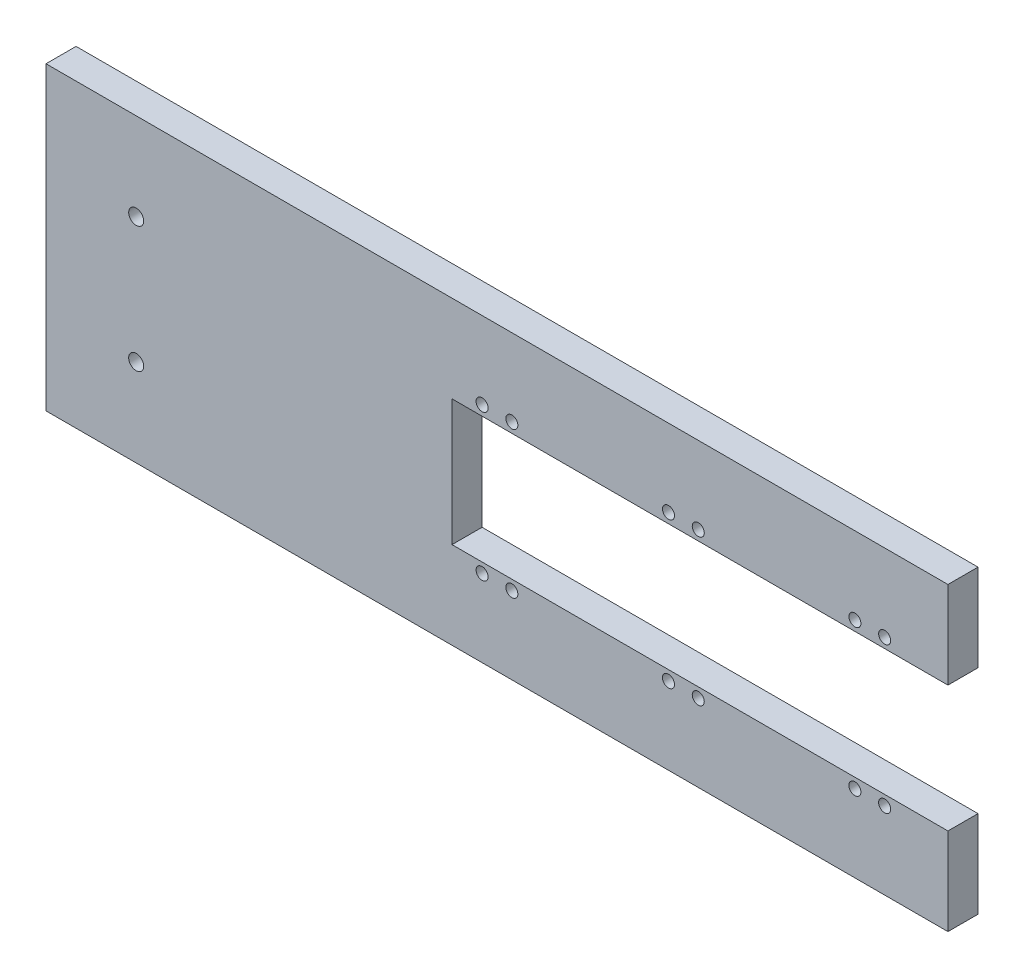
ISO-10303-21;
HEADER;
FILE_DESCRIPTION(('STEP AP214'),'2;1');
FILE_NAME('part.step','',(''),(''),'','','');
FILE_SCHEMA(('AUTOMOTIVE_DESIGN { 1 0 10303 214 1 1 1 1 }'));
ENDSEC;
DATA;
#1=APPLICATION_CONTEXT('core data for automotive mechanical design processes');
#2=APPLICATION_PROTOCOL_DEFINITION('international standard','automotive_design',2000,#1);
#3=PRODUCT_CONTEXT('',#1,'mechanical');
#4=PRODUCT('Part','Part','',(#3));
#5=PRODUCT_RELATED_PRODUCT_CATEGORY('part','',(#4));
#6=PRODUCT_DEFINITION_FORMATION('','',#4);
#7=PRODUCT_DEFINITION_CONTEXT('part definition',#1,'design');
#8=PRODUCT_DEFINITION('design','',#6,#7);
#9=PRODUCT_DEFINITION_SHAPE('','',#8);
#10=(LENGTH_UNIT() NAMED_UNIT(*) SI_UNIT(.MILLI.,.METRE.));
#11=(NAMED_UNIT(*) PLANE_ANGLE_UNIT() SI_UNIT($,.RADIAN.));
#12=(NAMED_UNIT(*) SI_UNIT($,.STERADIAN.) SOLID_ANGLE_UNIT());
#13=UNCERTAINTY_MEASURE_WITH_UNIT(LENGTH_MEASURE(1.E-05),#10,'distance_accuracy_value','');
#14=(GEOMETRIC_REPRESENTATION_CONTEXT(3) GLOBAL_UNCERTAINTY_ASSIGNED_CONTEXT((#13)) GLOBAL_UNIT_ASSIGNED_CONTEXT((#10,
#11,#12)) REPRESENTATION_CONTEXT('',''));
#15=CARTESIAN_POINT('',(0.,0.,0.));
#16=DIRECTION('',(0.,0.,1.));
#17=DIRECTION('',(1.,0.,0.));
#18=AXIS2_PLACEMENT_3D('',#15,#16,#17);
#19=CARTESIAN_POINT('',(150.,50.,-10.));
#20=DIRECTION('',(1.,0.,0.));
#21=DIRECTION('',(0.,0.,-1.));
#22=AXIS2_PLACEMENT_3D('',#19,#20,#21);
#23=PLANE('',#22);
#24=DIRECTION('',(0.,0.,1.));
#25=VECTOR('',#24,1.);
#26=CARTESIAN_POINT('',(150.,21.,-10.));
#27=LINE('',#26,#25);
#28=CARTESIAN_POINT('',(150.,21.,-10.));
#29=VERTEX_POINT('',#28);
#30=CARTESIAN_POINT('',(150.,21.,0.));
#31=VERTEX_POINT('',#30);
#32=EDGE_CURVE('E145',#29,#31,#27,.T.);
#33=ORIENTED_EDGE('',*,*,#32,.F.);
#34=DIRECTION('',(0.,1.,0.));
#35=VECTOR('',#34,1.);
#36=CARTESIAN_POINT('',(150.,50.,-10.));
#37=LINE('',#36,#35);
#38=CARTESIAN_POINT('',(150.,50.,-10.));
#39=VERTEX_POINT('',#38);
#40=EDGE_CURVE('E225',#29,#39,#37,.T.);
#41=ORIENTED_EDGE('',*,*,#40,.T.);
#42=DIRECTION('',(0.,0.,1.));
#43=VECTOR('',#42,1.);
#44=CARTESIAN_POINT('',(150.,50.,-10.));
#45=LINE('',#44,#43);
#46=CARTESIAN_POINT('',(150.,50.,0.));
#47=VERTEX_POINT('',#46);
#48=EDGE_CURVE('E46',#39,#47,#45,.T.);
#49=ORIENTED_EDGE('',*,*,#48,.T.);
#50=DIRECTION('',(0.,1.,0.));
#51=VECTOR('',#50,1.);
#52=CARTESIAN_POINT('',(150.,50.,0.));
#53=LINE('',#52,#51);
#54=EDGE_CURVE('E235',#31,#47,#53,.T.);
#55=ORIENTED_EDGE('',*,*,#54,.F.);
#56=EDGE_LOOP('',(#33,#41,#49,#55));
#57=FACE_BOUND('',#56,.T.);
#58=ADVANCED_FACE('F37',(#57),#23,.T.);
#59=CARTESIAN_POINT('',(-150.,50.,-10.));
#60=DIRECTION('',(-1.,0.,0.));
#61=DIRECTION('',(0.,0.,1.));
#62=AXIS2_PLACEMENT_3D('',#59,#60,#61);
#63=PLANE('',#62);
#64=DIRECTION('',(0.,-1.,0.));
#65=VECTOR('',#64,1.);
#66=CARTESIAN_POINT('',(-150.,50.,0.));
#67=LINE('',#66,#65);
#68=CARTESIAN_POINT('',(-150.,50.,0.));
#69=VERTEX_POINT('',#68);
#70=CARTESIAN_POINT('',(-150.,-50.,0.));
#71=VERTEX_POINT('',#70);
#72=EDGE_CURVE('E217',#69,#71,#67,.T.);
#73=ORIENTED_EDGE('',*,*,#72,.F.);
#74=DIRECTION('',(0.,0.,1.));
#75=VECTOR('',#74,1.);
#76=CARTESIAN_POINT('',(-150.,50.,-10.));
#77=LINE('',#76,#75);
#78=CARTESIAN_POINT('',(-150.,50.,-10.));
#79=VERTEX_POINT('',#78);
#80=EDGE_CURVE('E11',#79,#69,#77,.T.);
#81=ORIENTED_EDGE('',*,*,#80,.F.);
#82=DIRECTION('',(0.,-1.,0.));
#83=VECTOR('',#82,1.);
#84=CARTESIAN_POINT('',(-150.,50.,-10.));
#85=LINE('',#84,#83);
#86=CARTESIAN_POINT('',(-150.,-50.,-10.));
#87=VERTEX_POINT('',#86);
#88=EDGE_CURVE('E220',#79,#87,#85,.T.);
#89=ORIENTED_EDGE('',*,*,#88,.T.);
#90=DIRECTION('',(0.,0.,1.));
#91=VECTOR('',#90,1.);
#92=CARTESIAN_POINT('',(-150.,-50.,-10.));
#93=LINE('',#92,#91);
#94=EDGE_CURVE('E41',#87,#71,#93,.T.);
#95=ORIENTED_EDGE('',*,*,#94,.T.);
#96=EDGE_LOOP('',(#73,#81,#89,#95));
#97=FACE_BOUND('',#96,.T.);
#98=ADVANCED_FACE('F39',(#97),#63,.T.);
#99=CARTESIAN_POINT('',(-150.,50.,-10.));
#100=DIRECTION('',(0.,1.,0.));
#101=DIRECTION('',(0.,0.,1.));
#102=AXIS2_PLACEMENT_3D('',#99,#100,#101);
#103=PLANE('',#102);
#104=DIRECTION('',(-1.,0.,0.));
#105=VECTOR('',#104,1.);
#106=CARTESIAN_POINT('',(-150.,50.,0.));
#107=LINE('',#106,#105);
#108=EDGE_CURVE('E223',#47,#69,#107,.T.);
#109=ORIENTED_EDGE('',*,*,#108,.F.);
#110=ORIENTED_EDGE('',*,*,#48,.F.);
#111=DIRECTION('',(-1.,0.,0.));
#112=VECTOR('',#111,1.);
#113=CARTESIAN_POINT('',(-150.,50.,-10.));
#114=LINE('',#113,#112);
#115=EDGE_CURVE('E228',#39,#79,#114,.T.);
#116=ORIENTED_EDGE('',*,*,#115,.T.);
#117=ORIENTED_EDGE('',*,*,#80,.T.);
#118=EDGE_LOOP('',(#109,#110,#116,#117));
#119=FACE_BOUND('',#118,.T.);
#120=ADVANCED_FACE('F251',(#119),#103,.T.);
#121=DIRECTION('',(0.,0.,1.));
#122=VECTOR('',#121,1.);
#123=CARTESIAN_POINT('',(150.,-21.,-10.));
#124=LINE('',#123,#122);
#125=CARTESIAN_POINT('',(150.,-21.,-10.));
#126=VERTEX_POINT('',#125);
#127=CARTESIAN_POINT('',(150.,-21.,0.));
#128=VERTEX_POINT('',#127);
#129=EDGE_CURVE('E116',#126,#128,#124,.T.);
#130=ORIENTED_EDGE('',*,*,#129,.T.);
#131=CARTESIAN_POINT('',(150.,-50.,0.));
#132=VERTEX_POINT('',#131);
#133=EDGE_CURVE('E236',#132,#128,#53,.T.);
#134=ORIENTED_EDGE('',*,*,#133,.F.);
#135=DIRECTION('',(0.,0.,1.));
#136=VECTOR('',#135,1.);
#137=CARTESIAN_POINT('',(150.,-50.,-10.));
#138=LINE('',#137,#136);
#139=CARTESIAN_POINT('',(150.,-50.,-10.));
#140=VERTEX_POINT('',#139);
#141=EDGE_CURVE('E242',#140,#132,#138,.T.);
#142=ORIENTED_EDGE('',*,*,#141,.F.);
#143=EDGE_CURVE('E226',#140,#126,#37,.T.);
#144=ORIENTED_EDGE('',*,*,#143,.T.);
#145=EDGE_LOOP('',(#130,#134,#142,#144));
#146=FACE_BOUND('',#145,.T.);
#147=ADVANCED_FACE('F255',(#146),#23,.T.);
#148=CARTESIAN_POINT('',(-150.,-50.,-10.));
#149=DIRECTION('',(0.,-1.,0.));
#150=DIRECTION('',(0.,0.,-1.));
#151=AXIS2_PLACEMENT_3D('',#148,#149,#150);
#152=PLANE('',#151);
#153=DIRECTION('',(1.,0.,0.));
#154=VECTOR('',#153,1.);
#155=CARTESIAN_POINT('',(-150.,-50.,0.));
#156=LINE('',#155,#154);
#157=EDGE_CURVE('E232',#71,#132,#156,.T.);
#158=ORIENTED_EDGE('',*,*,#157,.F.);
#159=ORIENTED_EDGE('',*,*,#94,.F.);
#160=DIRECTION('',(1.,0.,0.));
#161=VECTOR('',#160,1.);
#162=CARTESIAN_POINT('',(-150.,-50.,-10.));
#163=LINE('',#162,#161);
#164=EDGE_CURVE('E222',#87,#140,#163,.T.);
#165=ORIENTED_EDGE('',*,*,#164,.T.);
#166=ORIENTED_EDGE('',*,*,#141,.T.);
#167=EDGE_LOOP('',(#158,#159,#165,#166));
#168=FACE_BOUND('',#167,.T.);
#169=ADVANCED_FACE('F244',(#168),#152,.T.);
#170=CARTESIAN_POINT('',(0.,0.,-10.));
#171=DIRECTION('',(0.,0.,1.));
#172=DIRECTION('',(1.,0.,0.));
#173=AXIS2_PLACEMENT_3D('',#170,#171,#172);
#174=PLANE('',#173);
#175=CARTESIAN_POINT('',(-120.,20.9311361599589,-10.));
#176=DIRECTION('',(0.,0.,1.));
#177=DIRECTION('',(1.,0.,0.));
#178=AXIS2_PLACEMENT_3D('',#175,#176,#177);
#179=CIRCLE('',#178,2.50000000000001);
#180=CARTESIAN_POINT('',(-117.5,20.9311361599589,-10.));
#181=VERTEX_POINT('',#180);
#182=EDGE_CURVE('E140',#181,#181,#179,.T.);
#183=ORIENTED_EDGE('',*,*,#182,.T.);
#184=EDGE_LOOP('',(#183));
#185=FACE_BOUND('',#184,.T.);
#186=CARTESIAN_POINT('',(-120.,-20.9311361599589,-10.));
#187=DIRECTION('',(0.,0.,1.));
#188=DIRECTION('',(-1.,0.,0.));
#189=AXIS2_PLACEMENT_3D('',#186,#187,#188);
#190=CIRCLE('',#189,2.50000000000001);
#191=CARTESIAN_POINT('',(-122.5,-20.9311361599589,-10.));
#192=VERTEX_POINT('',#191);
#193=EDGE_CURVE('E455',#192,#192,#190,.T.);
#194=ORIENTED_EDGE('',*,*,#193,.T.);
#195=EDGE_LOOP('',(#194));
#196=FACE_BOUND('',#195,.T.);
#197=CARTESIAN_POINT('',(128.95,24.3,-10.));
#198=DIRECTION('',(0.,0.,1.));
#199=DIRECTION('',(-1.,0.,0.));
#200=AXIS2_PLACEMENT_3D('',#197,#198,#199);
#201=CIRCLE('',#200,2.);
#202=CARTESIAN_POINT('',(126.95,24.3,-10.));
#203=VERTEX_POINT('',#202);
#204=EDGE_CURVE('E161',#203,#203,#201,.T.);
#205=ORIENTED_EDGE('',*,*,#204,.T.);
#206=EDGE_LOOP('',(#205));
#207=FACE_BOUND('',#206,.T.);
#208=CARTESIAN_POINT('',(119.05,24.3,-10.));
#209=DIRECTION('',(0.,0.,1.));
#210=DIRECTION('',(1.,0.,0.));
#211=AXIS2_PLACEMENT_3D('',#208,#209,#210);
#212=CIRCLE('',#211,2.);
#213=CARTESIAN_POINT('',(121.05,24.3,-10.));
#214=VERTEX_POINT('',#213);
#215=EDGE_CURVE('E155',#214,#214,#212,.T.);
#216=ORIENTED_EDGE('',*,*,#215,.T.);
#217=EDGE_LOOP('',(#216));
#218=FACE_BOUND('',#217,.T.);
#219=CARTESIAN_POINT('',(119.05,-24.3,-10.));
#220=DIRECTION('',(0.,0.,1.));
#221=DIRECTION('',(-1.,0.,0.));
#222=AXIS2_PLACEMENT_3D('',#219,#220,#221);
#223=CIRCLE('',#222,2.);
#224=CARTESIAN_POINT('',(117.05,-24.3,-10.));
#225=VERTEX_POINT('',#224);
#226=EDGE_CURVE('E148',#225,#225,#223,.T.);
#227=ORIENTED_EDGE('',*,*,#226,.T.);
#228=EDGE_LOOP('',(#227));
#229=FACE_BOUND('',#228,.T.);
#230=CARTESIAN_POINT('',(128.95,-24.3,-10.));
#231=DIRECTION('',(0.,0.,1.));
#232=DIRECTION('',(1.,0.,0.));
#233=AXIS2_PLACEMENT_3D('',#230,#231,#232);
#234=CIRCLE('',#233,2.);
#235=CARTESIAN_POINT('',(130.95,-24.3,-10.));
#236=VERTEX_POINT('',#235);
#237=EDGE_CURVE('E185',#236,#236,#234,.T.);
#238=ORIENTED_EDGE('',*,*,#237,.T.);
#239=EDGE_LOOP('',(#238));
#240=FACE_BOUND('',#239,.T.);
#241=CARTESIAN_POINT('',(66.95,24.3,-10.));
#242=DIRECTION('',(0.,0.,1.));
#243=DIRECTION('',(-1.,0.,0.));
#244=AXIS2_PLACEMENT_3D('',#241,#242,#243);
#245=CIRCLE('',#244,2.);
#246=CARTESIAN_POINT('',(64.95,24.3,-10.));
#247=VERTEX_POINT('',#246);
#248=EDGE_CURVE('E179',#247,#247,#245,.T.);
#249=ORIENTED_EDGE('',*,*,#248,.T.);
#250=EDGE_LOOP('',(#249));
#251=FACE_BOUND('',#250,.T.);
#252=CARTESIAN_POINT('',(57.05,24.3,-10.));
#253=DIRECTION('',(0.,0.,1.));
#254=DIRECTION('',(1.,0.,0.));
#255=AXIS2_PLACEMENT_3D('',#252,#253,#254);
#256=CIRCLE('',#255,2.);
#257=CARTESIAN_POINT('',(59.05,24.3,-10.));
#258=VERTEX_POINT('',#257);
#259=EDGE_CURVE('E173',#258,#258,#256,.T.);
#260=ORIENTED_EDGE('',*,*,#259,.T.);
#261=EDGE_LOOP('',(#260));
#262=FACE_BOUND('',#261,.T.);
#263=CARTESIAN_POINT('',(57.05,-24.3,-10.));
#264=DIRECTION('',(0.,0.,1.));
#265=DIRECTION('',(-1.,0.,0.));
#266=AXIS2_PLACEMENT_3D('',#263,#264,#265);
#267=CIRCLE('',#266,2.);
#268=CARTESIAN_POINT('',(55.05,-24.3,-10.));
#269=VERTEX_POINT('',#268);
#270=EDGE_CURVE('E166',#269,#269,#267,.T.);
#271=ORIENTED_EDGE('',*,*,#270,.T.);
#272=EDGE_LOOP('',(#271));
#273=FACE_BOUND('',#272,.T.);
#274=CARTESIAN_POINT('',(66.95,-24.3,-10.));
#275=DIRECTION('',(0.,0.,1.));
#276=DIRECTION('',(1.,0.,0.));
#277=AXIS2_PLACEMENT_3D('',#274,#275,#276);
#278=CIRCLE('',#277,2.);
#279=CARTESIAN_POINT('',(68.95,-24.3,-10.));
#280=VERTEX_POINT('',#279);
#281=EDGE_CURVE('E190',#280,#280,#278,.T.);
#282=ORIENTED_EDGE('',*,*,#281,.T.);
#283=EDGE_LOOP('',(#282));
#284=FACE_BOUND('',#283,.T.);
#285=CARTESIAN_POINT('',(4.95,24.3,-10.));
#286=DIRECTION('',(0.,0.,1.));
#287=DIRECTION('',(-1.,0.,0.));
#288=AXIS2_PLACEMENT_3D('',#285,#286,#287);
#289=CIRCLE('',#288,2.);
#290=CARTESIAN_POINT('',(2.95,24.3,-10.));
#291=VERTEX_POINT('',#290);
#292=EDGE_CURVE('E209',#291,#291,#289,.T.);
#293=ORIENTED_EDGE('',*,*,#292,.T.);
#294=EDGE_LOOP('',(#293));
#295=FACE_BOUND('',#294,.T.);
#296=CARTESIAN_POINT('',(-4.95,24.3,-10.));
#297=DIRECTION('',(0.,0.,1.));
#298=DIRECTION('',(1.,0.,0.));
#299=AXIS2_PLACEMENT_3D('',#296,#297,#298);
#300=CIRCLE('',#299,2.);
#301=CARTESIAN_POINT('',(-2.95,24.3,-10.));
#302=VERTEX_POINT('',#301);
#303=EDGE_CURVE('E203',#302,#302,#300,.T.);
#304=ORIENTED_EDGE('',*,*,#303,.T.);
#305=EDGE_LOOP('',(#304));
#306=FACE_BOUND('',#305,.T.);
#307=CARTESIAN_POINT('',(-4.95,-24.3,-10.));
#308=DIRECTION('',(0.,0.,1.));
#309=DIRECTION('',(-1.,0.,0.));
#310=AXIS2_PLACEMENT_3D('',#307,#308,#309);
#311=CIRCLE('',#310,2.);
#312=CARTESIAN_POINT('',(-6.95,-24.3,-10.));
#313=VERTEX_POINT('',#312);
#314=EDGE_CURVE('E196',#313,#313,#311,.T.);
#315=ORIENTED_EDGE('',*,*,#314,.T.);
#316=EDGE_LOOP('',(#315));
#317=FACE_BOUND('',#316,.T.);
#318=CARTESIAN_POINT('',(4.95,-24.3,-10.));
#319=DIRECTION('',(0.,0.,1.));
#320=DIRECTION('',(1.,0.,0.));
#321=AXIS2_PLACEMENT_3D('',#318,#319,#320);
#322=CIRCLE('',#321,2.);
#323=CARTESIAN_POINT('',(6.95,-24.3,-10.));
#324=VERTEX_POINT('',#323);
#325=EDGE_CURVE('E214',#324,#324,#322,.T.);
#326=ORIENTED_EDGE('',*,*,#325,.T.);
#327=EDGE_LOOP('',(#326));
#328=FACE_BOUND('',#327,.T.);
#329=ORIENTED_EDGE('',*,*,#40,.F.);
#330=DIRECTION('',(-1.,0.,0.));
#331=VECTOR('',#330,1.);
#332=CARTESIAN_POINT('',(-14.95,21.,-10.));
#333=LINE('',#332,#331);
#334=CARTESIAN_POINT('',(-14.95,21.,-10.));
#335=VERTEX_POINT('',#334);
#336=EDGE_CURVE('E117',#29,#335,#333,.T.);
#337=ORIENTED_EDGE('',*,*,#336,.T.);
#338=DIRECTION('',(0.,-1.,0.));
#339=VECTOR('',#338,1.);
#340=CARTESIAN_POINT('',(-14.95,21.,-10.));
#341=LINE('',#340,#339);
#342=CARTESIAN_POINT('',(-14.95,-21.,-10.));
#343=VERTEX_POINT('',#342);
#344=EDGE_CURVE('E112',#335,#343,#341,.T.);
#345=ORIENTED_EDGE('',*,*,#344,.T.);
#346=DIRECTION('',(1.,0.,0.));
#347=VECTOR('',#346,1.);
#348=CARTESIAN_POINT('',(-14.95,-21.,-10.));
#349=LINE('',#348,#347);
#350=EDGE_CURVE('E120',#343,#126,#349,.T.);
#351=ORIENTED_EDGE('',*,*,#350,.T.);
#352=ORIENTED_EDGE('',*,*,#143,.F.);
#353=ORIENTED_EDGE('',*,*,#164,.F.);
#354=ORIENTED_EDGE('',*,*,#88,.F.);
#355=ORIENTED_EDGE('',*,*,#115,.F.);
#356=EDGE_LOOP('',(#329,#337,#345,#351,#352,#353,#354,#355));
#357=FACE_BOUND('',#356,.T.);
#358=ADVANCED_FACE('F128',(#185,#196,#207,#218,#229,#240,#251,#262,#273,#284,#295,#306,#317,
#328,#357),#174,.F.);
#359=CARTESIAN_POINT('',(0.,0.,0.));
#360=DIRECTION('',(0.,0.,1.));
#361=DIRECTION('',(1.,0.,0.));
#362=AXIS2_PLACEMENT_3D('',#359,#360,#361);
#363=PLANE('',#362);
#364=CARTESIAN_POINT('',(-120.,20.9311361599589,0.));
#365=DIRECTION('',(0.,0.,1.));
#366=DIRECTION('',(1.,0.,0.));
#367=AXIS2_PLACEMENT_3D('',#364,#365,#366);
#368=CIRCLE('',#367,2.50000000000001);
#369=CARTESIAN_POINT('',(-117.5,20.9311361599589,0.));
#370=VERTEX_POINT('',#369);
#371=EDGE_CURVE('E454',#370,#370,#368,.T.);
#372=ORIENTED_EDGE('',*,*,#371,.F.);
#373=EDGE_LOOP('',(#372));
#374=FACE_BOUND('',#373,.T.);
#375=CARTESIAN_POINT('',(-120.,-20.9311361599589,0.));
#376=DIRECTION('',(0.,0.,1.));
#377=DIRECTION('',(-1.,0.,0.));
#378=AXIS2_PLACEMENT_3D('',#375,#376,#377);
#379=CIRCLE('',#378,2.50000000000001);
#380=CARTESIAN_POINT('',(-122.5,-20.9311361599589,0.));
#381=VERTEX_POINT('',#380);
#382=EDGE_CURVE('E135',#381,#381,#379,.T.);
#383=ORIENTED_EDGE('',*,*,#382,.F.);
#384=EDGE_LOOP('',(#383));
#385=FACE_BOUND('',#384,.T.);
#386=DIRECTION('',(-1.,0.,0.));
#387=VECTOR('',#386,1.);
#388=CARTESIAN_POINT('',(-14.95,21.,0.));
#389=LINE('',#388,#387);
#390=CARTESIAN_POINT('',(-14.95,21.,0.));
#391=VERTEX_POINT('',#390);
#392=EDGE_CURVE('E129',#31,#391,#389,.T.);
#393=ORIENTED_EDGE('',*,*,#392,.F.);
#394=ORIENTED_EDGE('',*,*,#54,.T.);
#395=ORIENTED_EDGE('',*,*,#108,.T.);
#396=ORIENTED_EDGE('',*,*,#72,.T.);
#397=ORIENTED_EDGE('',*,*,#157,.T.);
#398=ORIENTED_EDGE('',*,*,#133,.T.);
#399=DIRECTION('',(1.,0.,0.));
#400=VECTOR('',#399,1.);
#401=CARTESIAN_POINT('',(-14.95,-21.,0.));
#402=LINE('',#401,#400);
#403=CARTESIAN_POINT('',(-14.95,-21.,0.));
#404=VERTEX_POINT('',#403);
#405=EDGE_CURVE('E132',#404,#128,#402,.T.);
#406=ORIENTED_EDGE('',*,*,#405,.F.);
#407=DIRECTION('',(0.,-1.,0.));
#408=VECTOR('',#407,1.);
#409=CARTESIAN_POINT('',(-14.95,21.,0.));
#410=LINE('',#409,#408);
#411=EDGE_CURVE('E54',#391,#404,#410,.T.);
#412=ORIENTED_EDGE('',*,*,#411,.F.);
#413=EDGE_LOOP('',(#393,#394,#395,#396,#397,#398,#406,#412));
#414=FACE_BOUND('',#413,.T.);
#415=CARTESIAN_POINT('',(128.95,24.3,0.));
#416=DIRECTION('',(0.,0.,1.));
#417=DIRECTION('',(-1.,0.,0.));
#418=AXIS2_PLACEMENT_3D('',#415,#416,#417);
#419=CIRCLE('',#418,2.);
#420=CARTESIAN_POINT('',(126.95,24.3,0.));
#421=VERTEX_POINT('',#420);
#422=EDGE_CURVE('E144',#421,#421,#419,.T.);
#423=ORIENTED_EDGE('',*,*,#422,.F.);
#424=EDGE_LOOP('',(#423));
#425=FACE_BOUND('',#424,.T.);
#426=CARTESIAN_POINT('',(119.05,24.3,0.));
#427=DIRECTION('',(0.,0.,1.));
#428=DIRECTION('',(1.,0.,0.));
#429=AXIS2_PLACEMENT_3D('',#426,#427,#428);
#430=CIRCLE('',#429,2.);
#431=CARTESIAN_POINT('',(121.05,24.3,0.));
#432=VERTEX_POINT('',#431);
#433=EDGE_CURVE('E158',#432,#432,#430,.T.);
#434=ORIENTED_EDGE('',*,*,#433,.F.);
#435=EDGE_LOOP('',(#434));
#436=FACE_BOUND('',#435,.T.);
#437=CARTESIAN_POINT('',(119.05,-24.3,0.));
#438=DIRECTION('',(0.,0.,1.));
#439=DIRECTION('',(-1.,0.,0.));
#440=AXIS2_PLACEMENT_3D('',#437,#438,#439);
#441=CIRCLE('',#440,2.);
#442=CARTESIAN_POINT('',(117.05,-24.3,0.));
#443=VERTEX_POINT('',#442);
#444=EDGE_CURVE('E152',#443,#443,#441,.T.);
#445=ORIENTED_EDGE('',*,*,#444,.F.);
#446=EDGE_LOOP('',(#445));
#447=FACE_BOUND('',#446,.T.);
#448=CARTESIAN_POINT('',(128.95,-24.3,0.));
#449=DIRECTION('',(0.,0.,1.));
#450=DIRECTION('',(1.,0.,0.));
#451=AXIS2_PLACEMENT_3D('',#448,#449,#450);
#452=CIRCLE('',#451,2.);
#453=CARTESIAN_POINT('',(130.95,-24.3,0.));
#454=VERTEX_POINT('',#453);
#455=EDGE_CURVE('E151',#454,#454,#452,.T.);
#456=ORIENTED_EDGE('',*,*,#455,.F.);
#457=EDGE_LOOP('',(#456));
#458=FACE_BOUND('',#457,.T.);
#459=CARTESIAN_POINT('',(66.95,24.3,0.));
#460=DIRECTION('',(0.,0.,1.));
#461=DIRECTION('',(-1.,0.,0.));
#462=AXIS2_PLACEMENT_3D('',#459,#460,#461);
#463=CIRCLE('',#462,2.);
#464=CARTESIAN_POINT('',(64.95,24.3,0.));
#465=VERTEX_POINT('',#464);
#466=EDGE_CURVE('E182',#465,#465,#463,.T.);
#467=ORIENTED_EDGE('',*,*,#466,.F.);
#468=EDGE_LOOP('',(#467));
#469=FACE_BOUND('',#468,.T.);
#470=CARTESIAN_POINT('',(57.05,24.3,0.));
#471=DIRECTION('',(0.,0.,1.));
#472=DIRECTION('',(1.,0.,0.));
#473=AXIS2_PLACEMENT_3D('',#470,#471,#472);
#474=CIRCLE('',#473,2.);
#475=CARTESIAN_POINT('',(59.05,24.3,0.));
#476=VERTEX_POINT('',#475);
#477=EDGE_CURVE('E176',#476,#476,#474,.T.);
#478=ORIENTED_EDGE('',*,*,#477,.F.);
#479=EDGE_LOOP('',(#478));
#480=FACE_BOUND('',#479,.T.);
#481=CARTESIAN_POINT('',(57.05,-24.3,0.));
#482=DIRECTION('',(0.,0.,1.));
#483=DIRECTION('',(-1.,0.,0.));
#484=AXIS2_PLACEMENT_3D('',#481,#482,#483);
#485=CIRCLE('',#484,2.);
#486=CARTESIAN_POINT('',(55.05,-24.3,0.));
#487=VERTEX_POINT('',#486);
#488=EDGE_CURVE('E170',#487,#487,#485,.T.);
#489=ORIENTED_EDGE('',*,*,#488,.F.);
#490=EDGE_LOOP('',(#489));
#491=FACE_BOUND('',#490,.T.);
#492=CARTESIAN_POINT('',(66.95,-24.3,0.));
#493=DIRECTION('',(0.,0.,1.));
#494=DIRECTION('',(1.,0.,0.));
#495=AXIS2_PLACEMENT_3D('',#492,#493,#494);
#496=CIRCLE('',#495,2.);
#497=CARTESIAN_POINT('',(68.95,-24.3,0.));
#498=VERTEX_POINT('',#497);
#499=EDGE_CURVE('E169',#498,#498,#496,.T.);
#500=ORIENTED_EDGE('',*,*,#499,.F.);
#501=EDGE_LOOP('',(#500));
#502=FACE_BOUND('',#501,.T.);
#503=CARTESIAN_POINT('',(4.95,24.3,0.));
#504=DIRECTION('',(0.,0.,1.));
#505=DIRECTION('',(-1.,0.,0.));
#506=AXIS2_PLACEMENT_3D('',#503,#504,#505);
#507=CIRCLE('',#506,2.);
#508=CARTESIAN_POINT('',(2.95,24.3,0.));
#509=VERTEX_POINT('',#508);
#510=EDGE_CURVE('E193',#509,#509,#507,.T.);
#511=ORIENTED_EDGE('',*,*,#510,.F.);
#512=EDGE_LOOP('',(#511));
#513=FACE_BOUND('',#512,.T.);
#514=CARTESIAN_POINT('',(-4.95,24.3,0.));
#515=DIRECTION('',(0.,0.,1.));
#516=DIRECTION('',(1.,0.,0.));
#517=AXIS2_PLACEMENT_3D('',#514,#515,#516);
#518=CIRCLE('',#517,2.);
#519=CARTESIAN_POINT('',(-2.95,24.3,0.));
#520=VERTEX_POINT('',#519);
#521=EDGE_CURVE('E206',#520,#520,#518,.T.);
#522=ORIENTED_EDGE('',*,*,#521,.F.);
#523=EDGE_LOOP('',(#522));
#524=FACE_BOUND('',#523,.T.);
#525=CARTESIAN_POINT('',(-4.95,-24.3,0.));
#526=DIRECTION('',(0.,0.,1.));
#527=DIRECTION('',(-1.,0.,0.));
#528=AXIS2_PLACEMENT_3D('',#525,#526,#527);
#529=CIRCLE('',#528,2.);
#530=CARTESIAN_POINT('',(-6.95,-24.3,0.));
#531=VERTEX_POINT('',#530);
#532=EDGE_CURVE('E200',#531,#531,#529,.T.);
#533=ORIENTED_EDGE('',*,*,#532,.F.);
#534=EDGE_LOOP('',(#533));
#535=FACE_BOUND('',#534,.T.);
#536=CARTESIAN_POINT('',(4.95,-24.3,0.));
#537=DIRECTION('',(0.,0.,1.));
#538=DIRECTION('',(1.,0.,0.));
#539=AXIS2_PLACEMENT_3D('',#536,#537,#538);
#540=CIRCLE('',#539,2.);
#541=CARTESIAN_POINT('',(6.95,-24.3,0.));
#542=VERTEX_POINT('',#541);
#543=EDGE_CURVE('E199',#542,#542,#540,.T.);
#544=ORIENTED_EDGE('',*,*,#543,.F.);
#545=EDGE_LOOP('',(#544));
#546=FACE_BOUND('',#545,.T.);
#547=ADVANCED_FACE('F247',(#374,#385,#414,#425,#436,#447,#458,#469,#480,#491,#502,#513,#524,
#535,#546),#363,.T.);
#548=CARTESIAN_POINT('',(4.95,-24.3,-10.));
#549=DIRECTION('',(0.,0.,1.));
#550=DIRECTION('',(1.,0.,0.));
#551=AXIS2_PLACEMENT_3D('',#548,#549,#550);
#552=CYLINDRICAL_SURFACE('',#551,2.);
#553=ORIENTED_EDGE('',*,*,#325,.F.);
#554=EDGE_LOOP('',(#553));
#555=FACE_BOUND('',#554,.T.);
#556=ORIENTED_EDGE('',*,*,#543,.T.);
#557=EDGE_LOOP('',(#556));
#558=FACE_BOUND('',#557,.T.);
#559=ADVANCED_FACE('F286',(#555,#558),#552,.F.);
#560=CARTESIAN_POINT('',(-4.95,-24.3,-10.));
#561=DIRECTION('',(0.,0.,1.));
#562=DIRECTION('',(1.,0.,0.));
#563=AXIS2_PLACEMENT_3D('',#560,#561,#562);
#564=CYLINDRICAL_SURFACE('',#563,2.);
#565=ORIENTED_EDGE('',*,*,#314,.F.);
#566=EDGE_LOOP('',(#565));
#567=FACE_BOUND('',#566,.T.);
#568=ORIENTED_EDGE('',*,*,#532,.T.);
#569=EDGE_LOOP('',(#568));
#570=FACE_BOUND('',#569,.T.);
#571=ADVANCED_FACE('F293',(#567,#570),#564,.F.);
#572=CARTESIAN_POINT('',(-4.95,24.3,-10.));
#573=DIRECTION('',(0.,0.,1.));
#574=DIRECTION('',(1.,0.,0.));
#575=AXIS2_PLACEMENT_3D('',#572,#573,#574);
#576=CYLINDRICAL_SURFACE('',#575,2.);
#577=ORIENTED_EDGE('',*,*,#303,.F.);
#578=EDGE_LOOP('',(#577));
#579=FACE_BOUND('',#578,.T.);
#580=ORIENTED_EDGE('',*,*,#521,.T.);
#581=EDGE_LOOP('',(#580));
#582=FACE_BOUND('',#581,.T.);
#583=ADVANCED_FACE('F299',(#579,#582),#576,.F.);
#584=CARTESIAN_POINT('',(4.95,24.3,-10.));
#585=DIRECTION('',(0.,0.,1.));
#586=DIRECTION('',(1.,0.,0.));
#587=AXIS2_PLACEMENT_3D('',#584,#585,#586);
#588=CYLINDRICAL_SURFACE('',#587,2.);
#589=ORIENTED_EDGE('',*,*,#292,.F.);
#590=EDGE_LOOP('',(#589));
#591=FACE_BOUND('',#590,.T.);
#592=ORIENTED_EDGE('',*,*,#510,.T.);
#593=EDGE_LOOP('',(#592));
#594=FACE_BOUND('',#593,.T.);
#595=ADVANCED_FACE('F295',(#591,#594),#588,.F.);
#596=CARTESIAN_POINT('',(66.95,-24.3,-10.));
#597=DIRECTION('',(0.,0.,1.));
#598=DIRECTION('',(1.,0.,0.));
#599=AXIS2_PLACEMENT_3D('',#596,#597,#598);
#600=CYLINDRICAL_SURFACE('',#599,2.);
#601=ORIENTED_EDGE('',*,*,#281,.F.);
#602=EDGE_LOOP('',(#601));
#603=FACE_BOUND('',#602,.T.);
#604=ORIENTED_EDGE('',*,*,#499,.T.);
#605=EDGE_LOOP('',(#604));
#606=FACE_BOUND('',#605,.T.);
#607=ADVANCED_FACE('F298',(#603,#606),#600,.F.);
#608=CARTESIAN_POINT('',(57.05,-24.3,-10.));
#609=DIRECTION('',(0.,0.,1.));
#610=DIRECTION('',(1.,0.,0.));
#611=AXIS2_PLACEMENT_3D('',#608,#609,#610);
#612=CYLINDRICAL_SURFACE('',#611,2.);
#613=ORIENTED_EDGE('',*,*,#270,.F.);
#614=EDGE_LOOP('',(#613));
#615=FACE_BOUND('',#614,.T.);
#616=ORIENTED_EDGE('',*,*,#488,.T.);
#617=EDGE_LOOP('',(#616));
#618=FACE_BOUND('',#617,.T.);
#619=ADVANCED_FACE('F309',(#615,#618),#612,.F.);
#620=CARTESIAN_POINT('',(57.05,24.3,-10.));
#621=DIRECTION('',(0.,0.,1.));
#622=DIRECTION('',(1.,0.,0.));
#623=AXIS2_PLACEMENT_3D('',#620,#621,#622);
#624=CYLINDRICAL_SURFACE('',#623,2.);
#625=ORIENTED_EDGE('',*,*,#259,.F.);
#626=EDGE_LOOP('',(#625));
#627=FACE_BOUND('',#626,.T.);
#628=ORIENTED_EDGE('',*,*,#477,.T.);
#629=EDGE_LOOP('',(#628));
#630=FACE_BOUND('',#629,.T.);
#631=ADVANCED_FACE('F319',(#627,#630),#624,.F.);
#632=CARTESIAN_POINT('',(66.95,24.3,-10.));
#633=DIRECTION('',(0.,0.,1.));
#634=DIRECTION('',(1.,0.,0.));
#635=AXIS2_PLACEMENT_3D('',#632,#633,#634);
#636=CYLINDRICAL_SURFACE('',#635,2.);
#637=ORIENTED_EDGE('',*,*,#248,.F.);
#638=EDGE_LOOP('',(#637));
#639=FACE_BOUND('',#638,.T.);
#640=ORIENTED_EDGE('',*,*,#466,.T.);
#641=EDGE_LOOP('',(#640));
#642=FACE_BOUND('',#641,.T.);
#643=ADVANCED_FACE('F315',(#639,#642),#636,.F.);
#644=CARTESIAN_POINT('',(128.95,-24.3,-10.));
#645=DIRECTION('',(0.,0.,1.));
#646=DIRECTION('',(1.,0.,0.));
#647=AXIS2_PLACEMENT_3D('',#644,#645,#646);
#648=CYLINDRICAL_SURFACE('',#647,2.);
#649=ORIENTED_EDGE('',*,*,#237,.F.);
#650=EDGE_LOOP('',(#649));
#651=FACE_BOUND('',#650,.T.);
#652=ORIENTED_EDGE('',*,*,#455,.T.);
#653=EDGE_LOOP('',(#652));
#654=FACE_BOUND('',#653,.T.);
#655=ADVANCED_FACE('F311',(#651,#654),#648,.F.);
#656=CARTESIAN_POINT('',(119.05,-24.3,-10.));
#657=DIRECTION('',(0.,0.,1.));
#658=DIRECTION('',(1.,0.,0.));
#659=AXIS2_PLACEMENT_3D('',#656,#657,#658);
#660=CYLINDRICAL_SURFACE('',#659,2.);
#661=ORIENTED_EDGE('',*,*,#226,.F.);
#662=EDGE_LOOP('',(#661));
#663=FACE_BOUND('',#662,.T.);
#664=ORIENTED_EDGE('',*,*,#444,.T.);
#665=EDGE_LOOP('',(#664));
#666=FACE_BOUND('',#665,.T.);
#667=ADVANCED_FACE('F314',(#663,#666),#660,.F.);
#668=CARTESIAN_POINT('',(119.05,24.3,-10.));
#669=DIRECTION('',(0.,0.,1.));
#670=DIRECTION('',(1.,0.,0.));
#671=AXIS2_PLACEMENT_3D('',#668,#669,#670);
#672=CYLINDRICAL_SURFACE('',#671,2.);
#673=ORIENTED_EDGE('',*,*,#215,.F.);
#674=EDGE_LOOP('',(#673));
#675=FACE_BOUND('',#674,.T.);
#676=ORIENTED_EDGE('',*,*,#433,.T.);
#677=EDGE_LOOP('',(#676));
#678=FACE_BOUND('',#677,.T.);
#679=ADVANCED_FACE('F329',(#675,#678),#672,.F.);
#680=CARTESIAN_POINT('',(128.95,24.3,-10.));
#681=DIRECTION('',(0.,0.,1.));
#682=DIRECTION('',(1.,0.,0.));
#683=AXIS2_PLACEMENT_3D('',#680,#681,#682);
#684=CYLINDRICAL_SURFACE('',#683,2.);
#685=ORIENTED_EDGE('',*,*,#204,.F.);
#686=EDGE_LOOP('',(#685));
#687=FACE_BOUND('',#686,.T.);
#688=ORIENTED_EDGE('',*,*,#422,.T.);
#689=EDGE_LOOP('',(#688));
#690=FACE_BOUND('',#689,.T.);
#691=ADVANCED_FACE('F267',(#687,#690),#684,.F.);
#692=CARTESIAN_POINT('',(-14.95,21.,-10.));
#693=DIRECTION('',(-1.,0.,0.));
#694=DIRECTION('',(0.,0.,1.));
#695=AXIS2_PLACEMENT_3D('',#692,#693,#694);
#696=PLANE('',#695);
#697=ORIENTED_EDGE('',*,*,#411,.T.);
#698=DIRECTION('',(0.,0.,1.));
#699=VECTOR('',#698,1.);
#700=CARTESIAN_POINT('',(-14.95,-21.,-10.));
#701=LINE('',#700,#699);
#702=EDGE_CURVE('E108',#343,#404,#701,.T.);
#703=ORIENTED_EDGE('',*,*,#702,.F.);
#704=ORIENTED_EDGE('',*,*,#344,.F.);
#705=DIRECTION('',(0.,0.,1.));
#706=VECTOR('',#705,1.);
#707=CARTESIAN_POINT('',(-14.95,21.,-10.));
#708=LINE('',#707,#706);
#709=EDGE_CURVE('E142',#335,#391,#708,.T.);
#710=ORIENTED_EDGE('',*,*,#709,.T.);
#711=EDGE_LOOP('',(#697,#703,#704,#710));
#712=FACE_BOUND('',#711,.T.);
#713=ADVANCED_FACE('F110',(#712),#696,.F.);
#714=CARTESIAN_POINT('',(-14.95,21.,-10.));
#715=DIRECTION('',(0.,1.,0.));
#716=DIRECTION('',(0.,0.,1.));
#717=AXIS2_PLACEMENT_3D('',#714,#715,#716);
#718=PLANE('',#717);
#719=ORIENTED_EDGE('',*,*,#392,.T.);
#720=ORIENTED_EDGE('',*,*,#709,.F.);
#721=ORIENTED_EDGE('',*,*,#336,.F.);
#722=ORIENTED_EDGE('',*,*,#32,.T.);
#723=EDGE_LOOP('',(#719,#720,#721,#722));
#724=FACE_BOUND('',#723,.T.);
#725=ADVANCED_FACE('F258',(#724),#718,.F.);
#726=CARTESIAN_POINT('',(-14.95,-21.,-10.));
#727=DIRECTION('',(0.,-1.,0.));
#728=DIRECTION('',(0.,0.,-1.));
#729=AXIS2_PLACEMENT_3D('',#726,#727,#728);
#730=PLANE('',#729);
#731=ORIENTED_EDGE('',*,*,#405,.T.);
#732=ORIENTED_EDGE('',*,*,#129,.F.);
#733=ORIENTED_EDGE('',*,*,#350,.F.);
#734=ORIENTED_EDGE('',*,*,#702,.T.);
#735=EDGE_LOOP('',(#731,#732,#733,#734));
#736=FACE_BOUND('',#735,.T.);
#737=ADVANCED_FACE('F121',(#736),#730,.F.);
#738=CARTESIAN_POINT('',(-120.,-20.9311361599589,-10.));
#739=DIRECTION('',(0.,0.,1.));
#740=DIRECTION('',(1.,0.,0.));
#741=AXIS2_PLACEMENT_3D('',#738,#739,#740);
#742=CYLINDRICAL_SURFACE('',#741,2.50000000000001);
#743=ORIENTED_EDGE('',*,*,#193,.F.);
#744=EDGE_LOOP('',(#743));
#745=FACE_BOUND('',#744,.T.);
#746=ORIENTED_EDGE('',*,*,#382,.T.);
#747=EDGE_LOOP('',(#746));
#748=FACE_BOUND('',#747,.T.);
#749=ADVANCED_FACE('F265',(#745,#748),#742,.F.);
#750=CARTESIAN_POINT('',(-120.,20.9311361599589,-10.));
#751=DIRECTION('',(0.,0.,1.));
#752=DIRECTION('',(1.,0.,0.));
#753=AXIS2_PLACEMENT_3D('',#750,#751,#752);
#754=CYLINDRICAL_SURFACE('',#753,2.50000000000001);
#755=ORIENTED_EDGE('',*,*,#182,.F.);
#756=EDGE_LOOP('',(#755));
#757=FACE_BOUND('',#756,.T.);
#758=ORIENTED_EDGE('',*,*,#371,.T.);
#759=EDGE_LOOP('',(#758));
#760=FACE_BOUND('',#759,.T.);
#761=ADVANCED_FACE('F436',(#757,#760),#754,.F.);
#762=CLOSED_SHELL('',(#58,#98,#120,#147,#169,#358,#547,#559,#571,#583,#595,#607,#619,#631,#643,
#655,#667,#679,#691,#713,#725,#737,#749,#761));
#763=MANIFOLD_SOLID_BREP('B2',#762);
#764=ADVANCED_BREP_SHAPE_REPRESENTATION('',(#18,#763),#14);
#765=SHAPE_DEFINITION_REPRESENTATION(#9,#764);
ENDSEC;
END-ISO-10303-21;
